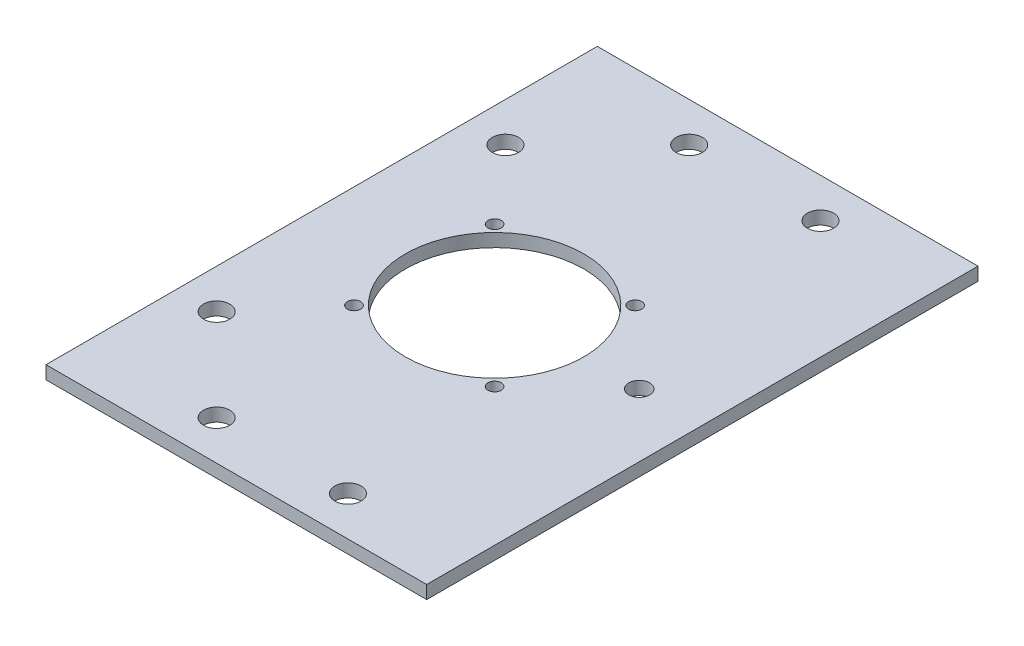
ISO-10303-21;
HEADER;
FILE_DESCRIPTION(('STEP AP214'),'2;1');
FILE_NAME('part.step','',(''),(''),'','','');
FILE_SCHEMA(('AUTOMOTIVE_DESIGN { 1 0 10303 214 1 1 1 1 }'));
ENDSEC;
DATA;
#1=APPLICATION_CONTEXT('core data for automotive mechanical design processes');
#2=APPLICATION_PROTOCOL_DEFINITION('international standard','automotive_design',2000,#1);
#3=PRODUCT_CONTEXT('',#1,'mechanical');
#4=PRODUCT('Part','Part','',(#3));
#5=PRODUCT_RELATED_PRODUCT_CATEGORY('part','',(#4));
#6=PRODUCT_DEFINITION_FORMATION('','',#4);
#7=PRODUCT_DEFINITION_CONTEXT('part definition',#1,'design');
#8=PRODUCT_DEFINITION('design','',#6,#7);
#9=PRODUCT_DEFINITION_SHAPE('','',#8);
#10=(LENGTH_UNIT() NAMED_UNIT(*) SI_UNIT(.MILLI.,.METRE.));
#11=(NAMED_UNIT(*) PLANE_ANGLE_UNIT() SI_UNIT($,.RADIAN.));
#12=(NAMED_UNIT(*) SI_UNIT($,.STERADIAN.) SOLID_ANGLE_UNIT());
#13=UNCERTAINTY_MEASURE_WITH_UNIT(LENGTH_MEASURE(1.E-05),#10,'distance_accuracy_value','');
#14=(GEOMETRIC_REPRESENTATION_CONTEXT(3) GLOBAL_UNCERTAINTY_ASSIGNED_CONTEXT((#13)) GLOBAL_UNIT_ASSIGNED_CONTEXT((#10,
#11,#12)) REPRESENTATION_CONTEXT('',''));
#15=CARTESIAN_POINT('',(0.,0.,0.));
#16=DIRECTION('',(0.,0.,1.));
#17=DIRECTION('',(1.,0.,0.));
#18=AXIS2_PLACEMENT_3D('',#15,#16,#17);
#19=CARTESIAN_POINT('',(-95.25,3.175,66.675));
#20=DIRECTION('',(-1.,0.,0.));
#21=DIRECTION('',(0.,0.,1.));
#22=AXIS2_PLACEMENT_3D('',#19,#20,#21);
#23=PLANE('',#22);
#24=DIRECTION('',(0.,0.,-1.));
#25=VECTOR('',#24,1.);
#26=CARTESIAN_POINT('',(-95.25,0.,66.675));
#27=LINE('',#26,#25);
#28=CARTESIAN_POINT('',(-95.25,0.,66.675));
#29=VERTEX_POINT('',#28);
#30=CARTESIAN_POINT('',(-95.25,0.,-66.675));
#31=VERTEX_POINT('',#30);
#32=EDGE_CURVE('E92',#29,#31,#27,.T.);
#33=ORIENTED_EDGE('',*,*,#32,.F.);
#34=DIRECTION('',(0.,-1.,0.));
#35=VECTOR('',#34,1.);
#36=CARTESIAN_POINT('',(-95.25,3.175,66.675));
#37=LINE('',#36,#35);
#38=CARTESIAN_POINT('',(-95.25,3.175,66.675));
#39=VERTEX_POINT('',#38);
#40=EDGE_CURVE('E11',#39,#29,#37,.T.);
#41=ORIENTED_EDGE('',*,*,#40,.F.);
#42=DIRECTION('',(0.,0.,-1.));
#43=VECTOR('',#42,1.);
#44=CARTESIAN_POINT('',(-95.25,3.175,66.675));
#45=LINE('',#44,#43);
#46=CARTESIAN_POINT('',(-95.25,3.175,-66.675));
#47=VERTEX_POINT('',#46);
#48=EDGE_CURVE('E95',#39,#47,#45,.T.);
#49=ORIENTED_EDGE('',*,*,#48,.T.);
#50=DIRECTION('',(0.,-1.,0.));
#51=VECTOR('',#50,1.);
#52=CARTESIAN_POINT('',(-95.25,3.175,-66.675));
#53=LINE('',#52,#51);
#54=EDGE_CURVE('E54',#47,#31,#53,.T.);
#55=ORIENTED_EDGE('',*,*,#54,.T.);
#56=EDGE_LOOP('',(#33,#41,#49,#55));
#57=FACE_BOUND('',#56,.T.);
#58=ADVANCED_FACE('F45',(#57),#23,.T.);
#59=CARTESIAN_POINT('',(-95.25,3.175,66.675));
#60=DIRECTION('',(0.,0.,-1.));
#61=DIRECTION('',(-1.,0.,0.));
#62=AXIS2_PLACEMENT_3D('',#59,#60,#61);
#63=PLANE('',#62);
#64=DIRECTION('',(1.,0.,0.));
#65=VECTOR('',#64,1.);
#66=CARTESIAN_POINT('',(-95.25,0.,66.675));
#67=LINE('',#66,#65);
#68=CARTESIAN_POINT('',(-3.17499999999997,0.,66.675));
#69=VERTEX_POINT('',#68);
#70=EDGE_CURVE('E83',#29,#69,#67,.T.);
#71=ORIENTED_EDGE('',*,*,#70,.T.);
#72=DIRECTION('',(0.,1.,0.));
#73=VECTOR('',#72,1.);
#74=CARTESIAN_POINT('',(-3.17499999999997,0.,66.675));
#75=LINE('',#74,#73);
#76=CARTESIAN_POINT('',(-3.17499999999997,3.175,66.675));
#77=VERTEX_POINT('',#76);
#78=EDGE_CURVE('E62',#69,#77,#75,.T.);
#79=ORIENTED_EDGE('',*,*,#78,.T.);
#80=DIRECTION('',(1.,0.,0.));
#81=VECTOR('',#80,1.);
#82=CARTESIAN_POINT('',(-95.25,3.175,66.675));
#83=LINE('',#82,#81);
#84=EDGE_CURVE('E85',#39,#77,#83,.T.);
#85=ORIENTED_EDGE('',*,*,#84,.F.);
#86=ORIENTED_EDGE('',*,*,#40,.T.);
#87=EDGE_LOOP('',(#71,#79,#85,#86));
#88=FACE_BOUND('',#87,.T.);
#89=ADVANCED_FACE('F82',(#88),#63,.F.);
#90=CARTESIAN_POINT('',(-95.25,3.175,-66.675));
#91=DIRECTION('',(0.,0.,-1.));
#92=DIRECTION('',(-1.,0.,0.));
#93=AXIS2_PLACEMENT_3D('',#90,#91,#92);
#94=PLANE('',#93);
#95=DIRECTION('',(0.,1.,0.));
#96=VECTOR('',#95,1.);
#97=CARTESIAN_POINT('',(-3.17499999999998,0.,-66.675));
#98=LINE('',#97,#96);
#99=CARTESIAN_POINT('',(-3.17499999999998,0.,-66.675));
#100=VERTEX_POINT('',#99);
#101=CARTESIAN_POINT('',(-3.17499999999998,3.175,-66.675));
#102=VERTEX_POINT('',#101);
#103=EDGE_CURVE('E164',#100,#102,#98,.T.);
#104=ORIENTED_EDGE('',*,*,#103,.F.);
#105=DIRECTION('',(1.,0.,0.));
#106=VECTOR('',#105,1.);
#107=CARTESIAN_POINT('',(-95.25,0.,-66.675));
#108=LINE('',#107,#106);
#109=EDGE_CURVE('E96',#31,#100,#108,.T.);
#110=ORIENTED_EDGE('',*,*,#109,.F.);
#111=ORIENTED_EDGE('',*,*,#54,.F.);
#112=DIRECTION('',(1.,0.,0.));
#113=VECTOR('',#112,1.);
#114=CARTESIAN_POINT('',(-95.25,3.175,-66.675));
#115=LINE('',#114,#113);
#116=EDGE_CURVE('E112',#47,#102,#115,.T.);
#117=ORIENTED_EDGE('',*,*,#116,.T.);
#118=EDGE_LOOP('',(#104,#110,#111,#117));
#119=FACE_BOUND('',#118,.T.);
#120=ADVANCED_FACE('F229',(#119),#94,.T.);
#121=CARTESIAN_POINT('',(0.,3.175,0.));
#122=DIRECTION('',(0.,-1.,0.));
#123=DIRECTION('',(0.,0.,-1.));
#124=AXIS2_PLACEMENT_3D('',#121,#122,#123);
#125=PLANE('',#124);
#126=CARTESIAN_POINT('',(-31.75,3.175,57.15));
#127=DIRECTION('',(0.,1.,0.));
#128=DIRECTION('',(0.,0.,1.));
#129=AXIS2_PLACEMENT_3D('',#126,#127,#128);
#130=CIRCLE('',#129,3.175);
#131=CARTESIAN_POINT('',(-31.75,3.175,60.325));
#132=VERTEX_POINT('',#131);
#133=EDGE_CURVE('E180',#132,#132,#130,.T.);
#134=ORIENTED_EDGE('',*,*,#133,.F.);
#135=EDGE_LOOP('',(#134));
#136=FACE_BOUND('',#135,.T.);
#137=CARTESIAN_POINT('',(-85.725,3.175,34.925));
#138=DIRECTION('',(0.,1.,0.));
#139=DIRECTION('',(0.,0.,1.));
#140=AXIS2_PLACEMENT_3D('',#137,#138,#139);
#141=CIRCLE('',#140,3.175);
#142=CARTESIAN_POINT('',(-85.725,3.175,38.1));
#143=VERTEX_POINT('',#142);
#144=EDGE_CURVE('E205',#143,#143,#141,.T.);
#145=ORIENTED_EDGE('',*,*,#144,.F.);
#146=EDGE_LOOP('',(#145));
#147=FACE_BOUND('',#146,.T.);
#148=CARTESIAN_POINT('',(-85.725,3.175,-34.925));
#149=DIRECTION('',(0.,1.,0.));
#150=DIRECTION('',(0.,0.,-1.));
#151=AXIS2_PLACEMENT_3D('',#148,#149,#150);
#152=CIRCLE('',#151,3.175);
#153=CARTESIAN_POINT('',(-85.725,3.175,-38.1));
#154=VERTEX_POINT('',#153);
#155=EDGE_CURVE('E197',#154,#154,#152,.T.);
#156=ORIENTED_EDGE('',*,*,#155,.F.);
#157=EDGE_LOOP('',(#156));
#158=FACE_BOUND('',#157,.T.);
#159=CARTESIAN_POINT('',(-31.75,3.175,-57.15));
#160=DIRECTION('',(0.,1.,0.));
#161=DIRECTION('',(0.,0.,-1.));
#162=AXIS2_PLACEMENT_3D('',#159,#160,#161);
#163=CIRCLE('',#162,3.175);
#164=CARTESIAN_POINT('',(-31.75,3.175,-60.325));
#165=VERTEX_POINT('',#164);
#166=EDGE_CURVE('E188',#165,#165,#163,.T.);
#167=ORIENTED_EDGE('',*,*,#166,.F.);
#168=EDGE_LOOP('',(#167));
#169=FACE_BOUND('',#168,.T.);
#170=CARTESIAN_POINT('',(-63.5,3.175,-57.15));
#171=DIRECTION('',(0.,1.,0.));
#172=DIRECTION('',(0.,0.,-1.));
#173=AXIS2_PLACEMENT_3D('',#170,#171,#172);
#174=CIRCLE('',#173,3.175);
#175=CARTESIAN_POINT('',(-63.5,3.175,-60.325));
#176=VERTEX_POINT('',#175);
#177=EDGE_CURVE('E189',#176,#176,#174,.T.);
#178=ORIENTED_EDGE('',*,*,#177,.F.);
#179=EDGE_LOOP('',(#178));
#180=FACE_BOUND('',#179,.T.);
#181=CARTESIAN_POINT('',(-63.5,3.175,57.15));
#182=DIRECTION('',(0.,1.,0.));
#183=DIRECTION('',(0.,0.,1.));
#184=AXIS2_PLACEMENT_3D('',#181,#182,#183);
#185=CIRCLE('',#184,3.175);
#186=CARTESIAN_POINT('',(-63.5,3.175,60.325));
#187=VERTEX_POINT('',#186);
#188=EDGE_CURVE('E176',#187,#187,#185,.T.);
#189=ORIENTED_EDGE('',*,*,#188,.F.);
#190=EDGE_LOOP('',(#189));
#191=FACE_BOUND('',#190,.T.);
#192=CARTESIAN_POINT('',(-18.4365,3.175,0.));
#193=DIRECTION('',(0.,1.,0.));
#194=DIRECTION('',(0.,0.,1.));
#195=AXIS2_PLACEMENT_3D('',#192,#193,#194);
#196=CIRCLE('',#195,2.5273);
#197=CARTESIAN_POINT('',(-18.4365,3.175,2.5273));
#198=VERTEX_POINT('',#197);
#199=EDGE_CURVE('E160',#198,#198,#196,.T.);
#200=ORIENTED_EDGE('',*,*,#199,.F.);
#201=EDGE_LOOP('',(#200));
#202=FACE_BOUND('',#201,.T.);
#203=CARTESIAN_POINT('',(-70.425,3.175,17.));
#204=DIRECTION('',(0.,1.,0.));
#205=DIRECTION('',(0.,0.,1.));
#206=AXIS2_PLACEMENT_3D('',#203,#204,#205);
#207=CIRCLE('',#206,1.6);
#208=CARTESIAN_POINT('',(-70.425,3.175,18.6));
#209=VERTEX_POINT('',#208);
#210=EDGE_CURVE('E137',#209,#209,#207,.T.);
#211=ORIENTED_EDGE('',*,*,#210,.F.);
#212=EDGE_LOOP('',(#211));
#213=FACE_BOUND('',#212,.T.);
#214=CARTESIAN_POINT('',(-36.425,3.175,17.));
#215=DIRECTION('',(0.,1.,0.));
#216=DIRECTION('',(0.,0.,1.));
#217=AXIS2_PLACEMENT_3D('',#214,#215,#216);
#218=CIRCLE('',#217,1.6);
#219=CARTESIAN_POINT('',(-36.425,3.175,18.6));
#220=VERTEX_POINT('',#219);
#221=EDGE_CURVE('E146',#220,#220,#218,.T.);
#222=ORIENTED_EDGE('',*,*,#221,.F.);
#223=EDGE_LOOP('',(#222));
#224=FACE_BOUND('',#223,.T.);
#225=CARTESIAN_POINT('',(-36.425,3.175,-17.));
#226=DIRECTION('',(0.,1.,0.));
#227=DIRECTION('',(0.,0.,1.));
#228=AXIS2_PLACEMENT_3D('',#225,#226,#227);
#229=CIRCLE('',#228,1.599999975);
#230=CARTESIAN_POINT('',(-36.425,3.175,-15.400000025));
#231=VERTEX_POINT('',#230);
#232=EDGE_CURVE('E136',#231,#231,#229,.T.);
#233=ORIENTED_EDGE('',*,*,#232,.F.);
#234=EDGE_LOOP('',(#233));
#235=FACE_BOUND('',#234,.T.);
#236=CARTESIAN_POINT('',(-70.425,3.175,-17.));
#237=DIRECTION('',(0.,1.,0.));
#238=DIRECTION('',(0.,0.,1.));
#239=AXIS2_PLACEMENT_3D('',#236,#237,#238);
#240=CIRCLE('',#239,1.6);
#241=CARTESIAN_POINT('',(-70.425,3.175,-15.4));
#242=VERTEX_POINT('',#241);
#243=EDGE_CURVE('E132',#242,#242,#240,.T.);
#244=ORIENTED_EDGE('',*,*,#243,.F.);
#245=EDGE_LOOP('',(#244));
#246=FACE_BOUND('',#245,.T.);
#247=CARTESIAN_POINT('',(-53.425,3.175,0.));
#248=DIRECTION('',(0.,1.,0.));
#249=DIRECTION('',(0.,0.,1.));
#250=AXIS2_PLACEMENT_3D('',#247,#248,#249);
#251=CIRCLE('',#250,21.59);
#252=CARTESIAN_POINT('',(-53.425,3.175,21.59));
#253=VERTEX_POINT('',#252);
#254=EDGE_CURVE('E106',#253,#253,#251,.T.);
#255=ORIENTED_EDGE('',*,*,#254,.F.);
#256=EDGE_LOOP('',(#255));
#257=FACE_BOUND('',#256,.T.);
#258=ORIENTED_EDGE('',*,*,#84,.T.);
#259=DIRECTION('',(0.,0.,1.));
#260=VECTOR('',#259,1.);
#261=CARTESIAN_POINT('',(-3.17499999999998,3.175,-66.675));
#262=LINE('',#261,#260);
#263=EDGE_CURVE('E170',#102,#77,#262,.T.);
#264=ORIENTED_EDGE('',*,*,#263,.F.);
#265=ORIENTED_EDGE('',*,*,#116,.F.);
#266=ORIENTED_EDGE('',*,*,#48,.F.);
#267=EDGE_LOOP('',(#258,#264,#265,#266));
#268=FACE_BOUND('',#267,.T.);
#269=ADVANCED_FACE('F226',(#136,#147,#158,#169,#180,#191,#202,#213,#224,#235,#246,#257,#268),
#125,.F.);
#270=CARTESIAN_POINT('',(0.,0.,0.));
#271=DIRECTION('',(0.,-1.,0.));
#272=DIRECTION('',(0.,0.,-1.));
#273=AXIS2_PLACEMENT_3D('',#270,#271,#272);
#274=PLANE('',#273);
#275=CARTESIAN_POINT('',(-31.75,0.,57.15));
#276=DIRECTION('',(0.,1.,0.));
#277=DIRECTION('',(0.,0.,1.));
#278=AXIS2_PLACEMENT_3D('',#275,#276,#277);
#279=CIRCLE('',#278,3.175);
#280=CARTESIAN_POINT('',(-31.75,0.,60.325));
#281=VERTEX_POINT('',#280);
#282=EDGE_CURVE('E209',#281,#281,#279,.T.);
#283=ORIENTED_EDGE('',*,*,#282,.T.);
#284=EDGE_LOOP('',(#283));
#285=FACE_BOUND('',#284,.T.);
#286=CARTESIAN_POINT('',(-85.725,0.,34.925));
#287=DIRECTION('',(0.,1.,0.));
#288=DIRECTION('',(0.,0.,1.));
#289=AXIS2_PLACEMENT_3D('',#286,#287,#288);
#290=CIRCLE('',#289,3.175);
#291=CARTESIAN_POINT('',(-85.725,0.,38.1));
#292=VERTEX_POINT('',#291);
#293=EDGE_CURVE('E201',#292,#292,#290,.T.);
#294=ORIENTED_EDGE('',*,*,#293,.T.);
#295=EDGE_LOOP('',(#294));
#296=FACE_BOUND('',#295,.T.);
#297=CARTESIAN_POINT('',(-85.725,0.,-34.925));
#298=DIRECTION('',(0.,1.,0.));
#299=DIRECTION('',(0.,0.,-1.));
#300=AXIS2_PLACEMENT_3D('',#297,#298,#299);
#301=CIRCLE('',#300,3.175);
#302=CARTESIAN_POINT('',(-85.725,0.,-38.1));
#303=VERTEX_POINT('',#302);
#304=EDGE_CURVE('E193',#303,#303,#301,.T.);
#305=ORIENTED_EDGE('',*,*,#304,.T.);
#306=EDGE_LOOP('',(#305));
#307=FACE_BOUND('',#306,.T.);
#308=CARTESIAN_POINT('',(-31.75,0.,-57.15));
#309=DIRECTION('',(0.,1.,0.));
#310=DIRECTION('',(0.,0.,-1.));
#311=AXIS2_PLACEMENT_3D('',#308,#309,#310);
#312=CIRCLE('',#311,3.175);
#313=CARTESIAN_POINT('',(-31.75,0.,-60.325));
#314=VERTEX_POINT('',#313);
#315=EDGE_CURVE('E184',#314,#314,#312,.T.);
#316=ORIENTED_EDGE('',*,*,#315,.T.);
#317=EDGE_LOOP('',(#316));
#318=FACE_BOUND('',#317,.T.);
#319=CARTESIAN_POINT('',(-63.5,0.,-57.15));
#320=DIRECTION('',(0.,1.,0.));
#321=DIRECTION('',(0.,0.,-1.));
#322=AXIS2_PLACEMENT_3D('',#319,#320,#321);
#323=CIRCLE('',#322,3.175);
#324=CARTESIAN_POINT('',(-63.5,0.,-60.325));
#325=VERTEX_POINT('',#324);
#326=EDGE_CURVE('E216',#325,#325,#323,.T.);
#327=ORIENTED_EDGE('',*,*,#326,.T.);
#328=EDGE_LOOP('',(#327));
#329=FACE_BOUND('',#328,.T.);
#330=CARTESIAN_POINT('',(-63.5,0.,57.15));
#331=DIRECTION('',(0.,1.,0.));
#332=DIRECTION('',(0.,0.,1.));
#333=AXIS2_PLACEMENT_3D('',#330,#331,#332);
#334=CIRCLE('',#333,3.175);
#335=CARTESIAN_POINT('',(-63.5,0.,60.325));
#336=VERTEX_POINT('',#335);
#337=EDGE_CURVE('E173',#336,#336,#334,.T.);
#338=ORIENTED_EDGE('',*,*,#337,.T.);
#339=EDGE_LOOP('',(#338));
#340=FACE_BOUND('',#339,.T.);
#341=DIRECTION('',(0.,0.,1.));
#342=VECTOR('',#341,1.);
#343=CARTESIAN_POINT('',(-3.17499999999998,0.,-66.675));
#344=LINE('',#343,#342);
#345=EDGE_CURVE('E93',#100,#69,#344,.T.);
#346=ORIENTED_EDGE('',*,*,#345,.T.);
#347=ORIENTED_EDGE('',*,*,#70,.F.);
#348=ORIENTED_EDGE('',*,*,#32,.T.);
#349=ORIENTED_EDGE('',*,*,#109,.T.);
#350=EDGE_LOOP('',(#346,#347,#348,#349));
#351=FACE_BOUND('',#350,.T.);
#352=CARTESIAN_POINT('',(-18.4365,0.,0.));
#353=DIRECTION('',(0.,-1.,0.));
#354=DIRECTION('',(0.,0.,-1.));
#355=AXIS2_PLACEMENT_3D('',#352,#353,#354);
#356=CIRCLE('',#355,2.5273);
#357=CARTESIAN_POINT('',(-18.4365,0.,-2.5273));
#358=VERTEX_POINT('',#357);
#359=EDGE_CURVE('E48',#358,#358,#356,.T.);
#360=ORIENTED_EDGE('',*,*,#359,.F.);
#361=EDGE_LOOP('',(#360));
#362=FACE_BOUND('',#361,.T.);
#363=CARTESIAN_POINT('',(-70.425,0.,17.));
#364=DIRECTION('',(0.,-1.,0.));
#365=DIRECTION('',(0.,0.,-1.));
#366=AXIS2_PLACEMENT_3D('',#363,#364,#365);
#367=CIRCLE('',#366,1.6);
#368=CARTESIAN_POINT('',(-70.425,0.,18.6));
#369=VERTEX_POINT('',#368);
#370=EDGE_CURVE('E142',#369,#369,#367,.F.);
#371=ORIENTED_EDGE('',*,*,#370,.T.);
#372=EDGE_LOOP('',(#371));
#373=FACE_BOUND('',#372,.T.);
#374=CARTESIAN_POINT('',(-36.425,0.,17.));
#375=DIRECTION('',(0.,-1.,0.));
#376=DIRECTION('',(0.,0.,-1.));
#377=AXIS2_PLACEMENT_3D('',#374,#375,#376);
#378=CIRCLE('',#377,1.6);
#379=CARTESIAN_POINT('',(-36.425,0.,18.6));
#380=VERTEX_POINT('',#379);
#381=EDGE_CURVE('E141',#380,#380,#378,.F.);
#382=ORIENTED_EDGE('',*,*,#381,.T.);
#383=EDGE_LOOP('',(#382));
#384=FACE_BOUND('',#383,.T.);
#385=CARTESIAN_POINT('',(-36.425,0.,-17.));
#386=DIRECTION('',(0.,-1.,0.));
#387=DIRECTION('',(0.,0.,-1.));
#388=AXIS2_PLACEMENT_3D('',#385,#386,#387);
#389=CIRCLE('',#388,1.599999975);
#390=CARTESIAN_POINT('',(-36.425,0.,-15.400000025));
#391=VERTEX_POINT('',#390);
#392=EDGE_CURVE('E150',#391,#391,#389,.F.);
#393=ORIENTED_EDGE('',*,*,#392,.T.);
#394=EDGE_LOOP('',(#393));
#395=FACE_BOUND('',#394,.T.);
#396=CARTESIAN_POINT('',(-70.425,0.,-17.));
#397=DIRECTION('',(0.,-1.,0.));
#398=DIRECTION('',(0.,0.,-1.));
#399=AXIS2_PLACEMENT_3D('',#396,#397,#398);
#400=CIRCLE('',#399,1.6);
#401=CARTESIAN_POINT('',(-70.425,0.,-15.4));
#402=VERTEX_POINT('',#401);
#403=EDGE_CURVE('E127',#402,#402,#400,.F.);
#404=ORIENTED_EDGE('',*,*,#403,.T.);
#405=EDGE_LOOP('',(#404));
#406=FACE_BOUND('',#405,.T.);
#407=CARTESIAN_POINT('',(-53.425,0.,0.));
#408=DIRECTION('',(0.,1.,0.));
#409=DIRECTION('',(0.,0.,1.));
#410=AXIS2_PLACEMENT_3D('',#407,#408,#409);
#411=CIRCLE('',#410,21.59);
#412=CARTESIAN_POINT('',(-53.425,0.,21.59));
#413=VERTEX_POINT('',#412);
#414=EDGE_CURVE('E100',#413,#413,#411,.T.);
#415=ORIENTED_EDGE('',*,*,#414,.T.);
#416=EDGE_LOOP('',(#415));
#417=FACE_BOUND('',#416,.T.);
#418=ADVANCED_FACE('F89',(#285,#296,#307,#318,#329,#340,#351,#362,#373,#384,#395,#406,#417),
#274,.T.);
#419=CARTESIAN_POINT('',(-53.425,0.,0.));
#420=DIRECTION('',(0.,1.,0.));
#421=DIRECTION('',(0.,0.,1.));
#422=AXIS2_PLACEMENT_3D('',#419,#420,#421);
#423=CYLINDRICAL_SURFACE('',#422,21.59);
#424=ORIENTED_EDGE('',*,*,#414,.F.);
#425=EDGE_LOOP('',(#424));
#426=FACE_BOUND('',#425,.T.);
#427=ORIENTED_EDGE('',*,*,#254,.T.);
#428=EDGE_LOOP('',(#427));
#429=FACE_BOUND('',#428,.T.);
#430=ADVANCED_FACE('F246',(#426,#429),#423,.F.);
#431=CARTESIAN_POINT('',(-70.425,-4.52548339959392,-17.));
#432=DIRECTION('',(0.,1.,0.));
#433=DIRECTION('',(0.,0.,1.));
#434=AXIS2_PLACEMENT_3D('',#431,#432,#433);
#435=CYLINDRICAL_SURFACE('',#434,1.6);
#436=CARTESIAN_POINT('',(-70.425,3.175,-15.4));
#437=CARTESIAN_POINT('',(-70.425,3.14192708333333,-15.4));
#438=CARTESIAN_POINT('',(-70.425,3.10885416666667,-15.4));
#439=CARTESIAN_POINT('',(-70.425,3.04270833333333,-15.4));
#440=CARTESIAN_POINT('',(-70.425,3.00963541666667,-15.4));
#441=CARTESIAN_POINT('',(-70.425,2.94348958333333,-15.4));
#442=CARTESIAN_POINT('',(-70.425,2.91041666666667,-15.4));
#443=CARTESIAN_POINT('',(-70.425,2.84427083333333,-15.4));
#444=CARTESIAN_POINT('',(-70.425,2.81119791666667,-15.4));
#445=CARTESIAN_POINT('',(-70.425,2.74505208333333,-15.4));
#446=CARTESIAN_POINT('',(-70.425,2.71197916666667,-15.4));
#447=CARTESIAN_POINT('',(-70.425,2.64583333333333,-15.4));
#448=CARTESIAN_POINT('',(-70.425,2.61276041666667,-15.4));
#449=CARTESIAN_POINT('',(-70.425,2.54661458333333,-15.4));
#450=CARTESIAN_POINT('',(-70.425,2.51354166666667,-15.4));
#451=CARTESIAN_POINT('',(-70.425,2.44739583333333,-15.4));
#452=CARTESIAN_POINT('',(-70.425,2.41432291666667,-15.4));
#453=CARTESIAN_POINT('',(-70.425,2.34817708333333,-15.4));
#454=CARTESIAN_POINT('',(-70.425,2.31510416666667,-15.4));
#455=CARTESIAN_POINT('',(-70.425,2.24895833333333,-15.4));
#456=CARTESIAN_POINT('',(-70.425,2.21588541666667,-15.4));
#457=CARTESIAN_POINT('',(-70.425,2.14973958333333,-15.4));
#458=CARTESIAN_POINT('',(-70.425,2.11666666666667,-15.4));
#459=CARTESIAN_POINT('',(-70.425,2.05052083333333,-15.4));
#460=CARTESIAN_POINT('',(-70.425,2.01744791666667,-15.4));
#461=CARTESIAN_POINT('',(-70.425,1.95130208333333,-15.4));
#462=CARTESIAN_POINT('',(-70.425,1.91822916666667,-15.4));
#463=CARTESIAN_POINT('',(-70.425,1.85208333333333,-15.4));
#464=CARTESIAN_POINT('',(-70.425,1.81901041666667,-15.4));
#465=CARTESIAN_POINT('',(-70.425,1.75286458333333,-15.4));
#466=CARTESIAN_POINT('',(-70.425,1.71979166666667,-15.4));
#467=CARTESIAN_POINT('',(-70.425,1.65364583333333,-15.4));
#468=CARTESIAN_POINT('',(-70.425,1.62057291666667,-15.4));
#469=CARTESIAN_POINT('',(-70.425,1.55442708333333,-15.4));
#470=CARTESIAN_POINT('',(-70.425,1.52135416666667,-15.4));
#471=CARTESIAN_POINT('',(-70.425,1.45520833333333,-15.4));
#472=CARTESIAN_POINT('',(-70.425,1.42213541666667,-15.4));
#473=CARTESIAN_POINT('',(-70.425,1.35598958333333,-15.4));
#474=CARTESIAN_POINT('',(-70.425,1.32291666666667,-15.4));
#475=CARTESIAN_POINT('',(-70.425,1.25677083333333,-15.4));
#476=CARTESIAN_POINT('',(-70.425,1.22369791666667,-15.4));
#477=CARTESIAN_POINT('',(-70.425,1.15755208333333,-15.4));
#478=CARTESIAN_POINT('',(-70.425,1.12447916666667,-15.4));
#479=CARTESIAN_POINT('',(-70.425,1.05833333333333,-15.4));
#480=CARTESIAN_POINT('',(-70.425,1.02526041666667,-15.4));
#481=CARTESIAN_POINT('',(-70.425,0.959114583333333,-15.4));
#482=CARTESIAN_POINT('',(-70.425,0.926041666666666,-15.4));
#483=CARTESIAN_POINT('',(-70.425,0.859895833333333,-15.4));
#484=CARTESIAN_POINT('',(-70.425,0.826822916666666,-15.4));
#485=CARTESIAN_POINT('',(-70.425,0.760677083333333,-15.4));
#486=CARTESIAN_POINT('',(-70.425,0.727604166666666,-15.4));
#487=CARTESIAN_POINT('',(-70.425,0.661458333333333,-15.4));
#488=CARTESIAN_POINT('',(-70.425,0.628385416666667,-15.4));
#489=CARTESIAN_POINT('',(-70.425,0.562239583333334,-15.4));
#490=CARTESIAN_POINT('',(-70.425,0.529166666666667,-15.4));
#491=CARTESIAN_POINT('',(-70.425,0.463020833333333,-15.4));
#492=CARTESIAN_POINT('',(-70.425,0.429947916666666,-15.4));
#493=CARTESIAN_POINT('',(-70.425,0.363802083333333,-15.4));
#494=CARTESIAN_POINT('',(-70.425,0.330729166666667,-15.4));
#495=CARTESIAN_POINT('',(-70.425,0.264583333333333,-15.4));
#496=CARTESIAN_POINT('',(-70.425,0.231510416666667,-15.4));
#497=CARTESIAN_POINT('',(-70.425,0.165364583333333,-15.4));
#498=CARTESIAN_POINT('',(-70.425,0.132291666666666,-15.4));
#499=CARTESIAN_POINT('',(-70.425,0.066145833333333,-15.4));
#500=CARTESIAN_POINT('',(-70.425,0.0330729166666665,-15.4));
#501=CARTESIAN_POINT('',(-70.425,0.,-15.4));
#502=B_SPLINE_CURVE_WITH_KNOTS('',3,(#436,#437,#438,#439,#440,#441,#442,#443,#444,#445,#446,
#447,#448,#449,#450,#451,#452,#453,#454,#455,#456,#457,#458,#459,#460,#461,#462,#463,#464,#465,
#466,#467,#468,#469,#470,#471,#472,#473,#474,#475,#476,#477,#478,#479,#480,#481,#482,#483,#484,
#485,#486,#487,#488,#489,#490,#491,#492,#493,#494,#495,#496,#497,#498,#499,#500,#501),
.UNSPECIFIED.,.F.,.F.,(4,2,2,2,2,2,2,2,2,2,2,2,2,2,2,2,2,2,2,2,2,2,2,2,2,2,2,2,2,2,2,2,4),(0.,
0.0992187500000004,0.1984375,0.29765625,0.396875,0.49609375,0.595312499999999,0.69453125,
0.793749999999999,0.89296875,0.9921875,1.09140625,1.190625,1.28984375,1.3890625,1.48828125,
1.5875,1.68671875,1.7859375,1.88515625,1.984375,2.08359375,2.1828125,2.28203125,2.38125,
2.48046875,2.5796875,2.67890625,2.778125,2.87734375,2.9765625,3.07578125,3.175),.UNSPECIFIED.);
#503=EDGE_CURVE('BSEAM248',#242,#402,#502,.T.);
#504=ORIENTED_EDGE('',*,*,#243,.T.);
#505=ORIENTED_EDGE('',*,*,#403,.F.);
#506=ORIENTED_EDGE('',*,*,#503,.T.);
#507=ORIENTED_EDGE('',*,*,#503,.F.);
#508=EDGE_LOOP('',(#504,#506,#505,#507));
#509=FACE_BOUND('',#508,.T.);
#510=ADVANCED_FACE('F248',(#509),#435,.F.);
#511=CARTESIAN_POINT('',(-36.425,-4.52548339959392,-17.));
#512=DIRECTION('',(0.,1.,0.));
#513=DIRECTION('',(0.,0.,1.));
#514=AXIS2_PLACEMENT_3D('',#511,#512,#513);
#515=CYLINDRICAL_SURFACE('',#514,1.599999975);
#516=CARTESIAN_POINT('',(-36.425,3.175,-15.400000025));
#517=CARTESIAN_POINT('',(-36.425,3.14192708333333,-15.400000025));
#518=CARTESIAN_POINT('',(-36.425,3.10885416666667,-15.400000025));
#519=CARTESIAN_POINT('',(-36.425,3.04270833333333,-15.400000025));
#520=CARTESIAN_POINT('',(-36.425,3.00963541666667,-15.400000025));
#521=CARTESIAN_POINT('',(-36.425,2.94348958333333,-15.400000025));
#522=CARTESIAN_POINT('',(-36.425,2.91041666666667,-15.400000025));
#523=CARTESIAN_POINT('',(-36.425,2.84427083333333,-15.400000025));
#524=CARTESIAN_POINT('',(-36.425,2.81119791666667,-15.400000025));
#525=CARTESIAN_POINT('',(-36.425,2.74505208333333,-15.400000025));
#526=CARTESIAN_POINT('',(-36.425,2.71197916666667,-15.400000025));
#527=CARTESIAN_POINT('',(-36.425,2.64583333333333,-15.400000025));
#528=CARTESIAN_POINT('',(-36.425,2.61276041666667,-15.400000025));
#529=CARTESIAN_POINT('',(-36.425,2.54661458333333,-15.400000025));
#530=CARTESIAN_POINT('',(-36.425,2.51354166666667,-15.400000025));
#531=CARTESIAN_POINT('',(-36.425,2.44739583333333,-15.400000025));
#532=CARTESIAN_POINT('',(-36.425,2.41432291666667,-15.400000025));
#533=CARTESIAN_POINT('',(-36.425,2.34817708333333,-15.400000025));
#534=CARTESIAN_POINT('',(-36.425,2.31510416666667,-15.400000025));
#535=CARTESIAN_POINT('',(-36.425,2.24895833333333,-15.400000025));
#536=CARTESIAN_POINT('',(-36.425,2.21588541666667,-15.400000025));
#537=CARTESIAN_POINT('',(-36.425,2.14973958333333,-15.400000025));
#538=CARTESIAN_POINT('',(-36.425,2.11666666666667,-15.400000025));
#539=CARTESIAN_POINT('',(-36.425,2.05052083333333,-15.400000025));
#540=CARTESIAN_POINT('',(-36.425,2.01744791666667,-15.400000025));
#541=CARTESIAN_POINT('',(-36.425,1.95130208333333,-15.400000025));
#542=CARTESIAN_POINT('',(-36.425,1.91822916666667,-15.400000025));
#543=CARTESIAN_POINT('',(-36.425,1.85208333333333,-15.400000025));
#544=CARTESIAN_POINT('',(-36.425,1.81901041666667,-15.400000025));
#545=CARTESIAN_POINT('',(-36.425,1.75286458333333,-15.400000025));
#546=CARTESIAN_POINT('',(-36.425,1.71979166666667,-15.400000025));
#547=CARTESIAN_POINT('',(-36.425,1.65364583333333,-15.400000025));
#548=CARTESIAN_POINT('',(-36.425,1.62057291666667,-15.400000025));
#549=CARTESIAN_POINT('',(-36.425,1.55442708333333,-15.400000025));
#550=CARTESIAN_POINT('',(-36.425,1.52135416666667,-15.400000025));
#551=CARTESIAN_POINT('',(-36.425,1.45520833333333,-15.400000025));
#552=CARTESIAN_POINT('',(-36.425,1.42213541666667,-15.400000025));
#553=CARTESIAN_POINT('',(-36.425,1.35598958333333,-15.400000025));
#554=CARTESIAN_POINT('',(-36.425,1.32291666666667,-15.400000025));
#555=CARTESIAN_POINT('',(-36.425,1.25677083333333,-15.400000025));
#556=CARTESIAN_POINT('',(-36.425,1.22369791666667,-15.400000025));
#557=CARTESIAN_POINT('',(-36.425,1.15755208333333,-15.400000025));
#558=CARTESIAN_POINT('',(-36.425,1.12447916666667,-15.400000025));
#559=CARTESIAN_POINT('',(-36.425,1.05833333333333,-15.400000025));
#560=CARTESIAN_POINT('',(-36.425,1.02526041666667,-15.400000025));
#561=CARTESIAN_POINT('',(-36.425,0.959114583333333,-15.400000025));
#562=CARTESIAN_POINT('',(-36.425,0.926041666666666,-15.400000025));
#563=CARTESIAN_POINT('',(-36.425,0.859895833333333,-15.400000025));
#564=CARTESIAN_POINT('',(-36.425,0.826822916666666,-15.400000025));
#565=CARTESIAN_POINT('',(-36.425,0.760677083333333,-15.400000025));
#566=CARTESIAN_POINT('',(-36.425,0.727604166666666,-15.400000025));
#567=CARTESIAN_POINT('',(-36.425,0.661458333333333,-15.400000025));
#568=CARTESIAN_POINT('',(-36.425,0.628385416666667,-15.400000025));
#569=CARTESIAN_POINT('',(-36.425,0.562239583333334,-15.400000025));
#570=CARTESIAN_POINT('',(-36.425,0.529166666666667,-15.400000025));
#571=CARTESIAN_POINT('',(-36.425,0.463020833333333,-15.400000025));
#572=CARTESIAN_POINT('',(-36.425,0.429947916666666,-15.400000025));
#573=CARTESIAN_POINT('',(-36.425,0.363802083333333,-15.400000025));
#574=CARTESIAN_POINT('',(-36.425,0.330729166666667,-15.400000025));
#575=CARTESIAN_POINT('',(-36.425,0.264583333333333,-15.400000025));
#576=CARTESIAN_POINT('',(-36.425,0.231510416666667,-15.400000025));
#577=CARTESIAN_POINT('',(-36.425,0.165364583333333,-15.400000025));
#578=CARTESIAN_POINT('',(-36.425,0.132291666666666,-15.400000025));
#579=CARTESIAN_POINT('',(-36.425,0.066145833333333,-15.400000025));
#580=CARTESIAN_POINT('',(-36.425,0.0330729166666665,-15.400000025));
#581=CARTESIAN_POINT('',(-36.425,0.,-15.400000025));
#582=B_SPLINE_CURVE_WITH_KNOTS('',3,(#516,#517,#518,#519,#520,#521,#522,#523,#524,#525,#526,
#527,#528,#529,#530,#531,#532,#533,#534,#535,#536,#537,#538,#539,#540,#541,#542,#543,#544,#545,
#546,#547,#548,#549,#550,#551,#552,#553,#554,#555,#556,#557,#558,#559,#560,#561,#562,#563,#564,
#565,#566,#567,#568,#569,#570,#571,#572,#573,#574,#575,#576,#577,#578,#579,#580,#581),
.UNSPECIFIED.,.F.,.F.,(4,2,2,2,2,2,2,2,2,2,2,2,2,2,2,2,2,2,2,2,2,2,2,2,2,2,2,2,2,2,2,2,4),(0.,
0.0992187500000004,0.1984375,0.29765625,0.396875,0.49609375,0.595312499999999,0.69453125,
0.793749999999999,0.89296875,0.9921875,1.09140625,1.190625,1.28984375,1.3890625,1.48828125,
1.5875,1.68671875,1.7859375,1.88515625,1.984375,2.08359375,2.1828125,2.28203125,2.38125,
2.48046875,2.5796875,2.67890625,2.778125,2.87734375,2.9765625,3.07578125,3.175),.UNSPECIFIED.);
#583=EDGE_CURVE('BSEAM255',#231,#391,#582,.T.);
#584=ORIENTED_EDGE('',*,*,#232,.T.);
#585=ORIENTED_EDGE('',*,*,#392,.F.);
#586=ORIENTED_EDGE('',*,*,#583,.T.);
#587=ORIENTED_EDGE('',*,*,#583,.F.);
#588=EDGE_LOOP('',(#584,#586,#585,#587));
#589=FACE_BOUND('',#588,.T.);
#590=ADVANCED_FACE('F255',(#589),#515,.F.);
#591=CARTESIAN_POINT('',(-36.425,-4.52548339959392,17.));
#592=DIRECTION('',(0.,1.,0.));
#593=DIRECTION('',(0.,0.,1.));
#594=AXIS2_PLACEMENT_3D('',#591,#592,#593);
#595=CYLINDRICAL_SURFACE('',#594,1.6);
#596=CARTESIAN_POINT('',(-36.425,3.175,18.6));
#597=CARTESIAN_POINT('',(-36.425,3.14192708333333,18.6));
#598=CARTESIAN_POINT('',(-36.425,3.10885416666667,18.6));
#599=CARTESIAN_POINT('',(-36.425,3.04270833333333,18.6));
#600=CARTESIAN_POINT('',(-36.425,3.00963541666667,18.6));
#601=CARTESIAN_POINT('',(-36.425,2.94348958333333,18.6));
#602=CARTESIAN_POINT('',(-36.425,2.91041666666667,18.6));
#603=CARTESIAN_POINT('',(-36.425,2.84427083333333,18.6));
#604=CARTESIAN_POINT('',(-36.425,2.81119791666667,18.6));
#605=CARTESIAN_POINT('',(-36.425,2.74505208333333,18.6));
#606=CARTESIAN_POINT('',(-36.425,2.71197916666667,18.6));
#607=CARTESIAN_POINT('',(-36.425,2.64583333333333,18.6));
#608=CARTESIAN_POINT('',(-36.425,2.61276041666667,18.6));
#609=CARTESIAN_POINT('',(-36.425,2.54661458333333,18.6));
#610=CARTESIAN_POINT('',(-36.425,2.51354166666667,18.6));
#611=CARTESIAN_POINT('',(-36.425,2.44739583333333,18.6));
#612=CARTESIAN_POINT('',(-36.425,2.41432291666667,18.6));
#613=CARTESIAN_POINT('',(-36.425,2.34817708333333,18.6));
#614=CARTESIAN_POINT('',(-36.425,2.31510416666667,18.6));
#615=CARTESIAN_POINT('',(-36.425,2.24895833333333,18.6));
#616=CARTESIAN_POINT('',(-36.425,2.21588541666667,18.6));
#617=CARTESIAN_POINT('',(-36.425,2.14973958333333,18.6));
#618=CARTESIAN_POINT('',(-36.425,2.11666666666667,18.6));
#619=CARTESIAN_POINT('',(-36.425,2.05052083333333,18.6));
#620=CARTESIAN_POINT('',(-36.425,2.01744791666667,18.6));
#621=CARTESIAN_POINT('',(-36.425,1.95130208333333,18.6));
#622=CARTESIAN_POINT('',(-36.425,1.91822916666667,18.6));
#623=CARTESIAN_POINT('',(-36.425,1.85208333333333,18.6));
#624=CARTESIAN_POINT('',(-36.425,1.81901041666667,18.6));
#625=CARTESIAN_POINT('',(-36.425,1.75286458333333,18.6));
#626=CARTESIAN_POINT('',(-36.425,1.71979166666667,18.6));
#627=CARTESIAN_POINT('',(-36.425,1.65364583333333,18.6));
#628=CARTESIAN_POINT('',(-36.425,1.62057291666667,18.6));
#629=CARTESIAN_POINT('',(-36.425,1.55442708333333,18.6));
#630=CARTESIAN_POINT('',(-36.425,1.52135416666667,18.6));
#631=CARTESIAN_POINT('',(-36.425,1.45520833333333,18.6));
#632=CARTESIAN_POINT('',(-36.425,1.42213541666667,18.6));
#633=CARTESIAN_POINT('',(-36.425,1.35598958333333,18.6));
#634=CARTESIAN_POINT('',(-36.425,1.32291666666667,18.6));
#635=CARTESIAN_POINT('',(-36.425,1.25677083333333,18.6));
#636=CARTESIAN_POINT('',(-36.425,1.22369791666667,18.6));
#637=CARTESIAN_POINT('',(-36.425,1.15755208333333,18.6));
#638=CARTESIAN_POINT('',(-36.425,1.12447916666667,18.6));
#639=CARTESIAN_POINT('',(-36.425,1.05833333333333,18.6));
#640=CARTESIAN_POINT('',(-36.425,1.02526041666667,18.6));
#641=CARTESIAN_POINT('',(-36.425,0.959114583333333,18.6));
#642=CARTESIAN_POINT('',(-36.425,0.926041666666666,18.6));
#643=CARTESIAN_POINT('',(-36.425,0.859895833333333,18.6));
#644=CARTESIAN_POINT('',(-36.425,0.826822916666666,18.6));
#645=CARTESIAN_POINT('',(-36.425,0.760677083333333,18.6));
#646=CARTESIAN_POINT('',(-36.425,0.727604166666666,18.6));
#647=CARTESIAN_POINT('',(-36.425,0.661458333333333,18.6));
#648=CARTESIAN_POINT('',(-36.425,0.628385416666667,18.6));
#649=CARTESIAN_POINT('',(-36.425,0.562239583333334,18.6));
#650=CARTESIAN_POINT('',(-36.425,0.529166666666667,18.6));
#651=CARTESIAN_POINT('',(-36.425,0.463020833333333,18.6));
#652=CARTESIAN_POINT('',(-36.425,0.429947916666666,18.6));
#653=CARTESIAN_POINT('',(-36.425,0.363802083333333,18.6));
#654=CARTESIAN_POINT('',(-36.425,0.330729166666667,18.6));
#655=CARTESIAN_POINT('',(-36.425,0.264583333333333,18.6));
#656=CARTESIAN_POINT('',(-36.425,0.231510416666667,18.6));
#657=CARTESIAN_POINT('',(-36.425,0.165364583333333,18.6));
#658=CARTESIAN_POINT('',(-36.425,0.132291666666666,18.6));
#659=CARTESIAN_POINT('',(-36.425,0.066145833333333,18.6));
#660=CARTESIAN_POINT('',(-36.425,0.0330729166666665,18.6));
#661=CARTESIAN_POINT('',(-36.425,0.,18.6));
#662=B_SPLINE_CURVE_WITH_KNOTS('',3,(#596,#597,#598,#599,#600,#601,#602,#603,#604,#605,#606,
#607,#608,#609,#610,#611,#612,#613,#614,#615,#616,#617,#618,#619,#620,#621,#622,#623,#624,#625,
#626,#627,#628,#629,#630,#631,#632,#633,#634,#635,#636,#637,#638,#639,#640,#641,#642,#643,#644,
#645,#646,#647,#648,#649,#650,#651,#652,#653,#654,#655,#656,#657,#658,#659,#660,#661),
.UNSPECIFIED.,.F.,.F.,(4,2,2,2,2,2,2,2,2,2,2,2,2,2,2,2,2,2,2,2,2,2,2,2,2,2,2,2,2,2,2,2,4),(0.,
0.0992187500000004,0.1984375,0.29765625,0.396875,0.49609375,0.595312499999999,0.69453125,
0.793749999999999,0.89296875,0.9921875,1.09140625,1.190625,1.28984375,1.3890625,1.48828125,
1.5875,1.68671875,1.7859375,1.88515625,1.984375,2.08359375,2.1828125,2.28203125,2.38125,
2.48046875,2.5796875,2.67890625,2.778125,2.87734375,2.9765625,3.07578125,3.175),.UNSPECIFIED.);
#663=EDGE_CURVE('BSEAM291',#220,#380,#662,.T.);
#664=ORIENTED_EDGE('',*,*,#221,.T.);
#665=ORIENTED_EDGE('',*,*,#381,.F.);
#666=ORIENTED_EDGE('',*,*,#663,.T.);
#667=ORIENTED_EDGE('',*,*,#663,.F.);
#668=EDGE_LOOP('',(#664,#666,#665,#667));
#669=FACE_BOUND('',#668,.T.);
#670=ADVANCED_FACE('F291',(#669),#595,.F.);
#671=CARTESIAN_POINT('',(-70.425,-4.52548339959392,17.));
#672=DIRECTION('',(0.,1.,0.));
#673=DIRECTION('',(0.,0.,1.));
#674=AXIS2_PLACEMENT_3D('',#671,#672,#673);
#675=CYLINDRICAL_SURFACE('',#674,1.6);
#676=CARTESIAN_POINT('',(-70.425,3.175,18.6));
#677=CARTESIAN_POINT('',(-70.425,3.14192708333333,18.6));
#678=CARTESIAN_POINT('',(-70.425,3.10885416666667,18.6));
#679=CARTESIAN_POINT('',(-70.425,3.04270833333333,18.6));
#680=CARTESIAN_POINT('',(-70.425,3.00963541666667,18.6));
#681=CARTESIAN_POINT('',(-70.425,2.94348958333333,18.6));
#682=CARTESIAN_POINT('',(-70.425,2.91041666666667,18.6));
#683=CARTESIAN_POINT('',(-70.425,2.84427083333333,18.6));
#684=CARTESIAN_POINT('',(-70.425,2.81119791666667,18.6));
#685=CARTESIAN_POINT('',(-70.425,2.74505208333333,18.6));
#686=CARTESIAN_POINT('',(-70.425,2.71197916666667,18.6));
#687=CARTESIAN_POINT('',(-70.425,2.64583333333333,18.6));
#688=CARTESIAN_POINT('',(-70.425,2.61276041666667,18.6));
#689=CARTESIAN_POINT('',(-70.425,2.54661458333333,18.6));
#690=CARTESIAN_POINT('',(-70.425,2.51354166666667,18.6));
#691=CARTESIAN_POINT('',(-70.425,2.44739583333333,18.6));
#692=CARTESIAN_POINT('',(-70.425,2.41432291666667,18.6));
#693=CARTESIAN_POINT('',(-70.425,2.34817708333333,18.6));
#694=CARTESIAN_POINT('',(-70.425,2.31510416666667,18.6));
#695=CARTESIAN_POINT('',(-70.425,2.24895833333333,18.6));
#696=CARTESIAN_POINT('',(-70.425,2.21588541666667,18.6));
#697=CARTESIAN_POINT('',(-70.425,2.14973958333333,18.6));
#698=CARTESIAN_POINT('',(-70.425,2.11666666666667,18.6));
#699=CARTESIAN_POINT('',(-70.425,2.05052083333333,18.6));
#700=CARTESIAN_POINT('',(-70.425,2.01744791666667,18.6));
#701=CARTESIAN_POINT('',(-70.425,1.95130208333333,18.6));
#702=CARTESIAN_POINT('',(-70.425,1.91822916666667,18.6));
#703=CARTESIAN_POINT('',(-70.425,1.85208333333333,18.6));
#704=CARTESIAN_POINT('',(-70.425,1.81901041666667,18.6));
#705=CARTESIAN_POINT('',(-70.425,1.75286458333333,18.6));
#706=CARTESIAN_POINT('',(-70.425,1.71979166666667,18.6));
#707=CARTESIAN_POINT('',(-70.425,1.65364583333333,18.6));
#708=CARTESIAN_POINT('',(-70.425,1.62057291666667,18.6));
#709=CARTESIAN_POINT('',(-70.425,1.55442708333333,18.6));
#710=CARTESIAN_POINT('',(-70.425,1.52135416666667,18.6));
#711=CARTESIAN_POINT('',(-70.425,1.45520833333333,18.6));
#712=CARTESIAN_POINT('',(-70.425,1.42213541666667,18.6));
#713=CARTESIAN_POINT('',(-70.425,1.35598958333333,18.6));
#714=CARTESIAN_POINT('',(-70.425,1.32291666666667,18.6));
#715=CARTESIAN_POINT('',(-70.425,1.25677083333333,18.6));
#716=CARTESIAN_POINT('',(-70.425,1.22369791666667,18.6));
#717=CARTESIAN_POINT('',(-70.425,1.15755208333333,18.6));
#718=CARTESIAN_POINT('',(-70.425,1.12447916666667,18.6));
#719=CARTESIAN_POINT('',(-70.425,1.05833333333333,18.6));
#720=CARTESIAN_POINT('',(-70.425,1.02526041666667,18.6));
#721=CARTESIAN_POINT('',(-70.425,0.959114583333333,18.6));
#722=CARTESIAN_POINT('',(-70.425,0.926041666666666,18.6));
#723=CARTESIAN_POINT('',(-70.425,0.859895833333333,18.6));
#724=CARTESIAN_POINT('',(-70.425,0.826822916666666,18.6));
#725=CARTESIAN_POINT('',(-70.425,0.760677083333333,18.6));
#726=CARTESIAN_POINT('',(-70.425,0.727604166666666,18.6));
#727=CARTESIAN_POINT('',(-70.425,0.661458333333333,18.6));
#728=CARTESIAN_POINT('',(-70.425,0.628385416666667,18.6));
#729=CARTESIAN_POINT('',(-70.425,0.562239583333334,18.6));
#730=CARTESIAN_POINT('',(-70.425,0.529166666666667,18.6));
#731=CARTESIAN_POINT('',(-70.425,0.463020833333333,18.6));
#732=CARTESIAN_POINT('',(-70.425,0.429947916666666,18.6));
#733=CARTESIAN_POINT('',(-70.425,0.363802083333333,18.6));
#734=CARTESIAN_POINT('',(-70.425,0.330729166666667,18.6));
#735=CARTESIAN_POINT('',(-70.425,0.264583333333333,18.6));
#736=CARTESIAN_POINT('',(-70.425,0.231510416666667,18.6));
#737=CARTESIAN_POINT('',(-70.425,0.165364583333333,18.6));
#738=CARTESIAN_POINT('',(-70.425,0.132291666666666,18.6));
#739=CARTESIAN_POINT('',(-70.425,0.066145833333333,18.6));
#740=CARTESIAN_POINT('',(-70.425,0.0330729166666665,18.6));
#741=CARTESIAN_POINT('',(-70.425,0.,18.6));
#742=B_SPLINE_CURVE_WITH_KNOTS('',3,(#676,#677,#678,#679,#680,#681,#682,#683,#684,#685,#686,
#687,#688,#689,#690,#691,#692,#693,#694,#695,#696,#697,#698,#699,#700,#701,#702,#703,#704,#705,
#706,#707,#708,#709,#710,#711,#712,#713,#714,#715,#716,#717,#718,#719,#720,#721,#722,#723,#724,
#725,#726,#727,#728,#729,#730,#731,#732,#733,#734,#735,#736,#737,#738,#739,#740,#741),
.UNSPECIFIED.,.F.,.F.,(4,2,2,2,2,2,2,2,2,2,2,2,2,2,2,2,2,2,2,2,2,2,2,2,2,2,2,2,2,2,2,2,4),(0.,
0.0992187500000004,0.1984375,0.29765625,0.396875,0.49609375,0.595312499999999,0.69453125,
0.793749999999999,0.89296875,0.9921875,1.09140625,1.190625,1.28984375,1.3890625,1.48828125,
1.5875,1.68671875,1.7859375,1.88515625,1.984375,2.08359375,2.1828125,2.28203125,2.38125,
2.48046875,2.5796875,2.67890625,2.778125,2.87734375,2.9765625,3.07578125,3.175),.UNSPECIFIED.);
#743=EDGE_CURVE('BSEAM284',#209,#369,#742,.T.);
#744=ORIENTED_EDGE('',*,*,#210,.T.);
#745=ORIENTED_EDGE('',*,*,#370,.F.);
#746=ORIENTED_EDGE('',*,*,#743,.T.);
#747=ORIENTED_EDGE('',*,*,#743,.F.);
#748=EDGE_LOOP('',(#744,#746,#745,#747));
#749=FACE_BOUND('',#748,.T.);
#750=ADVANCED_FACE('F284',(#749),#675,.F.);
#751=CARTESIAN_POINT('',(-18.4365,-6.825,0.));
#752=DIRECTION('',(0.,1.,0.));
#753=DIRECTION('',(0.,0.,1.));
#754=AXIS2_PLACEMENT_3D('',#751,#752,#753);
#755=CYLINDRICAL_SURFACE('',#754,2.5273);
#756=ORIENTED_EDGE('',*,*,#359,.T.);
#757=EDGE_LOOP('',(#756));
#758=FACE_BOUND('',#757,.T.);
#759=ORIENTED_EDGE('',*,*,#199,.T.);
#760=EDGE_LOOP('',(#759));
#761=FACE_BOUND('',#760,.T.);
#762=ADVANCED_FACE('F277',(#758,#761),#755,.F.);
#763=CARTESIAN_POINT('',(-3.17499999999998,0.,-66.675));
#764=DIRECTION('',(-1.,0.,0.));
#765=DIRECTION('',(0.,0.,1.));
#766=AXIS2_PLACEMENT_3D('',#763,#764,#765);
#767=PLANE('',#766);
#768=ORIENTED_EDGE('',*,*,#263,.T.);
#769=ORIENTED_EDGE('',*,*,#78,.F.);
#770=ORIENTED_EDGE('',*,*,#345,.F.);
#771=ORIENTED_EDGE('',*,*,#103,.T.);
#772=EDGE_LOOP('',(#768,#769,#770,#771));
#773=FACE_BOUND('',#772,.T.);
#774=ADVANCED_FACE('F274',(#773),#767,.F.);
#775=CARTESIAN_POINT('',(-63.5,0.,57.15));
#776=DIRECTION('',(0.,1.,0.));
#777=DIRECTION('',(0.,0.,1.));
#778=AXIS2_PLACEMENT_3D('',#775,#776,#777);
#779=CYLINDRICAL_SURFACE('',#778,3.175);
#780=ORIENTED_EDGE('',*,*,#337,.F.);
#781=EDGE_LOOP('',(#780));
#782=FACE_BOUND('',#781,.T.);
#783=ORIENTED_EDGE('',*,*,#188,.T.);
#784=EDGE_LOOP('',(#783));
#785=FACE_BOUND('',#784,.T.);
#786=ADVANCED_FACE('F276',(#782,#785),#779,.F.);
#787=CARTESIAN_POINT('',(-63.5,0.,-57.15));
#788=DIRECTION('',(0.,1.,0.));
#789=DIRECTION('',(0.,0.,1.));
#790=AXIS2_PLACEMENT_3D('',#787,#788,#789);
#791=CYLINDRICAL_SURFACE('',#790,3.175);
#792=ORIENTED_EDGE('',*,*,#326,.F.);
#793=EDGE_LOOP('',(#792));
#794=FACE_BOUND('',#793,.T.);
#795=ORIENTED_EDGE('',*,*,#177,.T.);
#796=EDGE_LOOP('',(#795));
#797=FACE_BOUND('',#796,.T.);
#798=ADVANCED_FACE('F224',(#794,#797),#791,.F.);
#799=CARTESIAN_POINT('',(-31.75,0.,-57.15));
#800=DIRECTION('',(0.,1.,0.));
#801=DIRECTION('',(0.,0.,1.));
#802=AXIS2_PLACEMENT_3D('',#799,#800,#801);
#803=CYLINDRICAL_SURFACE('',#802,3.175);
#804=ORIENTED_EDGE('',*,*,#315,.F.);
#805=EDGE_LOOP('',(#804));
#806=FACE_BOUND('',#805,.T.);
#807=ORIENTED_EDGE('',*,*,#166,.T.);
#808=EDGE_LOOP('',(#807));
#809=FACE_BOUND('',#808,.T.);
#810=ADVANCED_FACE('F340',(#806,#809),#803,.F.);
#811=CARTESIAN_POINT('',(-85.725,0.,-34.925));
#812=DIRECTION('',(0.,1.,0.));
#813=DIRECTION('',(0.,0.,1.));
#814=AXIS2_PLACEMENT_3D('',#811,#812,#813);
#815=CYLINDRICAL_SURFACE('',#814,3.175);
#816=ORIENTED_EDGE('',*,*,#304,.F.);
#817=EDGE_LOOP('',(#816));
#818=FACE_BOUND('',#817,.T.);
#819=ORIENTED_EDGE('',*,*,#155,.T.);
#820=EDGE_LOOP('',(#819));
#821=FACE_BOUND('',#820,.T.);
#822=ADVANCED_FACE('F350',(#818,#821),#815,.F.);
#823=CARTESIAN_POINT('',(-85.725,0.,34.925));
#824=DIRECTION('',(0.,1.,0.));
#825=DIRECTION('',(0.,0.,1.));
#826=AXIS2_PLACEMENT_3D('',#823,#824,#825);
#827=CYLINDRICAL_SURFACE('',#826,3.175);
#828=ORIENTED_EDGE('',*,*,#293,.F.);
#829=EDGE_LOOP('',(#828));
#830=FACE_BOUND('',#829,.T.);
#831=ORIENTED_EDGE('',*,*,#144,.T.);
#832=EDGE_LOOP('',(#831));
#833=FACE_BOUND('',#832,.T.);
#834=ADVANCED_FACE('F359',(#830,#833),#827,.F.);
#835=CARTESIAN_POINT('',(-31.75,0.,57.15));
#836=DIRECTION('',(0.,1.,0.));
#837=DIRECTION('',(0.,0.,1.));
#838=AXIS2_PLACEMENT_3D('',#835,#836,#837);
#839=CYLINDRICAL_SURFACE('',#838,3.175);
#840=ORIENTED_EDGE('',*,*,#282,.F.);
#841=EDGE_LOOP('',(#840));
#842=FACE_BOUND('',#841,.T.);
#843=ORIENTED_EDGE('',*,*,#133,.T.);
#844=EDGE_LOOP('',(#843));
#845=FACE_BOUND('',#844,.T.);
#846=ADVANCED_FACE('F369',(#842,#845),#839,.F.);
#847=CLOSED_SHELL('',(#58,#89,#120,#269,#418,#430,#510,#590,#670,#750,#762,#774,#786,#798,#810,
#822,#834,#846));
#848=MANIFOLD_SOLID_BREP('B2',#847);
#849=ADVANCED_BREP_SHAPE_REPRESENTATION('',(#18,#848),#14);
#850=SHAPE_DEFINITION_REPRESENTATION(#9,#849);
ENDSEC;
END-ISO-10303-21;
